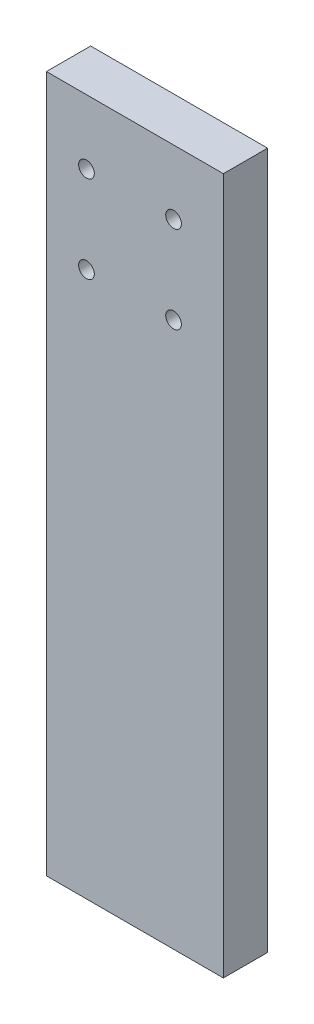
ISO-10303-21;
HEADER;
FILE_DESCRIPTION(('STEP AP214'),'2;1');
FILE_NAME('part.step','',(''),(''),'','','');
FILE_SCHEMA(('AUTOMOTIVE_DESIGN { 1 0 10303 214 1 1 1 1 }'));
ENDSEC;
DATA;
#1=APPLICATION_CONTEXT('core data for automotive mechanical design processes');
#2=APPLICATION_PROTOCOL_DEFINITION('international standard','automotive_design',2000,#1);
#3=PRODUCT_CONTEXT('',#1,'mechanical');
#4=PRODUCT('Part','Part','',(#3));
#5=PRODUCT_RELATED_PRODUCT_CATEGORY('part','',(#4));
#6=PRODUCT_DEFINITION_FORMATION('','',#4);
#7=PRODUCT_DEFINITION_CONTEXT('part definition',#1,'design');
#8=PRODUCT_DEFINITION('design','',#6,#7);
#9=PRODUCT_DEFINITION_SHAPE('','',#8);
#10=(LENGTH_UNIT() NAMED_UNIT(*) SI_UNIT(.MILLI.,.METRE.));
#11=(NAMED_UNIT(*) PLANE_ANGLE_UNIT() SI_UNIT($,.RADIAN.));
#12=(NAMED_UNIT(*) SI_UNIT($,.STERADIAN.) SOLID_ANGLE_UNIT());
#13=UNCERTAINTY_MEASURE_WITH_UNIT(LENGTH_MEASURE(1.E-05),#10,'distance_accuracy_value','');
#14=(GEOMETRIC_REPRESENTATION_CONTEXT(3) GLOBAL_UNCERTAINTY_ASSIGNED_CONTEXT((#13)) GLOBAL_UNIT_ASSIGNED_CONTEXT((#10,
#11,#12)) REPRESENTATION_CONTEXT('',''));
#15=CARTESIAN_POINT('',(0.,0.,0.));
#16=DIRECTION('',(0.,0.,1.));
#17=DIRECTION('',(1.,0.,0.));
#18=AXIS2_PLACEMENT_3D('',#15,#16,#17);
#19=CARTESIAN_POINT('',(26.8,0.,12.7));
#20=DIRECTION('',(1.,0.,0.));
#21=DIRECTION('',(0.,1.,0.));
#22=AXIS2_PLACEMENT_3D('',#19,#20,#21);
#23=PLANE('',#22);
#24=DIRECTION('',(0.,-1.,0.));
#25=VECTOR('',#24,1.);
#26=CARTESIAN_POINT('',(26.8,0.,0.));
#27=LINE('',#26,#25);
#28=CARTESIAN_POINT('',(26.8,62.,0.));
#29=VERTEX_POINT('',#28);
#30=CARTESIAN_POINT('',(26.8,-138.,0.));
#31=VERTEX_POINT('',#30);
#32=EDGE_CURVE('E114',#29,#31,#27,.T.);
#33=ORIENTED_EDGE('',*,*,#32,.F.);
#34=DIRECTION('',(0.,0.,-1.));
#35=VECTOR('',#34,1.);
#36=CARTESIAN_POINT('',(26.8,62.,12.7));
#37=LINE('',#36,#35);
#38=CARTESIAN_POINT('',(26.8,62.,12.7));
#39=VERTEX_POINT('',#38);
#40=EDGE_CURVE('E11',#39,#29,#37,.T.);
#41=ORIENTED_EDGE('',*,*,#40,.F.);
#42=DIRECTION('',(0.,-1.,0.));
#43=VECTOR('',#42,1.);
#44=CARTESIAN_POINT('',(26.8,0.,12.7));
#45=LINE('',#44,#43);
#46=CARTESIAN_POINT('',(26.8,-138.,12.7));
#47=VERTEX_POINT('',#46);
#48=EDGE_CURVE('E94',#39,#47,#45,.T.);
#49=ORIENTED_EDGE('',*,*,#48,.T.);
#50=DIRECTION('',(0.,0.,-1.));
#51=VECTOR('',#50,1.);
#52=CARTESIAN_POINT('',(26.8,-138.,12.7));
#53=LINE('',#52,#51);
#54=EDGE_CURVE('E73',#47,#31,#53,.T.);
#55=ORIENTED_EDGE('',*,*,#54,.T.);
#56=EDGE_LOOP('',(#33,#41,#49,#55));
#57=FACE_BOUND('',#56,.T.);
#58=ADVANCED_FACE('F33',(#57),#23,.T.);
#59=CARTESIAN_POINT('',(0.,62.,12.7));
#60=DIRECTION('',(0.,1.,0.));
#61=DIRECTION('',(0.,0.,1.));
#62=AXIS2_PLACEMENT_3D('',#59,#60,#61);
#63=PLANE('',#62);
#64=DIRECTION('',(1.,0.,0.));
#65=VECTOR('',#64,1.);
#66=CARTESIAN_POINT('',(0.,62.,0.));
#67=LINE('',#66,#65);
#68=CARTESIAN_POINT('',(-24.,62.,0.));
#69=VERTEX_POINT('',#68);
#70=EDGE_CURVE('E85',#69,#29,#67,.T.);
#71=ORIENTED_EDGE('',*,*,#70,.F.);
#72=DIRECTION('',(0.,0.,-1.));
#73=VECTOR('',#72,1.);
#74=CARTESIAN_POINT('',(-24.,62.,12.7));
#75=LINE('',#74,#73);
#76=CARTESIAN_POINT('',(-24.,62.,12.7));
#77=VERTEX_POINT('',#76);
#78=EDGE_CURVE('E42',#77,#69,#75,.T.);
#79=ORIENTED_EDGE('',*,*,#78,.F.);
#80=DIRECTION('',(1.,0.,0.));
#81=VECTOR('',#80,1.);
#82=CARTESIAN_POINT('',(0.,62.,12.7));
#83=LINE('',#82,#81);
#84=EDGE_CURVE('E83',#77,#39,#83,.T.);
#85=ORIENTED_EDGE('',*,*,#84,.T.);
#86=ORIENTED_EDGE('',*,*,#40,.T.);
#87=EDGE_LOOP('',(#71,#79,#85,#86));
#88=FACE_BOUND('',#87,.T.);
#89=ADVANCED_FACE('F81',(#88),#63,.T.);
#90=CARTESIAN_POINT('',(-24.,0.,12.7));
#91=DIRECTION('',(1.,0.,0.));
#92=DIRECTION('',(0.,1.,0.));
#93=AXIS2_PLACEMENT_3D('',#90,#91,#92);
#94=PLANE('',#93);
#95=DIRECTION('',(0.,-1.,0.));
#96=VECTOR('',#95,1.);
#97=CARTESIAN_POINT('',(-24.,0.,0.));
#98=LINE('',#97,#96);
#99=CARTESIAN_POINT('',(-24.,-138.,0.));
#100=VERTEX_POINT('',#99);
#101=EDGE_CURVE('E117',#69,#100,#98,.T.);
#102=ORIENTED_EDGE('',*,*,#101,.T.);
#103=DIRECTION('',(0.,0.,-1.));
#104=VECTOR('',#103,1.);
#105=CARTESIAN_POINT('',(-24.,-138.,12.7));
#106=LINE('',#105,#104);
#107=CARTESIAN_POINT('',(-24.,-138.,12.7));
#108=VERTEX_POINT('',#107);
#109=EDGE_CURVE('E88',#108,#100,#106,.T.);
#110=ORIENTED_EDGE('',*,*,#109,.F.);
#111=DIRECTION('',(0.,-1.,0.));
#112=VECTOR('',#111,1.);
#113=CARTESIAN_POINT('',(-24.,0.,12.7));
#114=LINE('',#113,#112);
#115=EDGE_CURVE('E90',#77,#108,#114,.T.);
#116=ORIENTED_EDGE('',*,*,#115,.F.);
#117=ORIENTED_EDGE('',*,*,#78,.T.);
#118=EDGE_LOOP('',(#102,#110,#116,#117));
#119=FACE_BOUND('',#118,.T.);
#120=ADVANCED_FACE('F91',(#119),#94,.F.);
#121=CARTESIAN_POINT('',(-12.5,18.5,12.7));
#122=DIRECTION('',(0.,0.,-1.));
#123=DIRECTION('',(-1.,0.,0.));
#124=AXIS2_PLACEMENT_3D('',#121,#122,#123);
#125=CYLINDRICAL_SURFACE('',#124,2.25);
#126=CARTESIAN_POINT('',(-12.5,18.5,12.7));
#127=DIRECTION('',(0.,0.,1.));
#128=DIRECTION('',(1.,0.,0.));
#129=AXIS2_PLACEMENT_3D('',#126,#127,#128);
#130=CIRCLE('',#129,2.25);
#131=CARTESIAN_POINT('',(-10.25,18.5,12.7));
#132=VERTEX_POINT('',#131);
#133=EDGE_CURVE('E96',#132,#132,#130,.T.);
#134=ORIENTED_EDGE('',*,*,#133,.T.);
#135=EDGE_LOOP('',(#134));
#136=FACE_BOUND('',#135,.T.);
#137=CARTESIAN_POINT('',(-12.5,18.5,0.));
#138=DIRECTION('',(0.,0.,1.));
#139=DIRECTION('',(1.,0.,0.));
#140=AXIS2_PLACEMENT_3D('',#137,#138,#139);
#141=CIRCLE('',#140,2.25);
#142=CARTESIAN_POINT('',(-10.25,18.5,0.));
#143=VERTEX_POINT('',#142);
#144=EDGE_CURVE('E111',#143,#143,#141,.T.);
#145=ORIENTED_EDGE('',*,*,#144,.F.);
#146=EDGE_LOOP('',(#145));
#147=FACE_BOUND('',#146,.T.);
#148=ADVANCED_FACE('F133',(#136,#147),#125,.F.);
#149=CARTESIAN_POINT('',(12.5,18.5,12.7));
#150=DIRECTION('',(0.,0.,-1.));
#151=DIRECTION('',(-1.,0.,0.));
#152=AXIS2_PLACEMENT_3D('',#149,#150,#151);
#153=CYLINDRICAL_SURFACE('',#152,2.25);
#154=CARTESIAN_POINT('',(12.5,18.5,12.7));
#155=DIRECTION('',(0.,0.,1.));
#156=DIRECTION('',(1.,0.,0.));
#157=AXIS2_PLACEMENT_3D('',#154,#155,#156);
#158=CIRCLE('',#157,2.25);
#159=CARTESIAN_POINT('',(14.75,18.5,12.7));
#160=VERTEX_POINT('',#159);
#161=EDGE_CURVE('E267',#160,#160,#158,.T.);
#162=ORIENTED_EDGE('',*,*,#161,.T.);
#163=EDGE_LOOP('',(#162));
#164=FACE_BOUND('',#163,.T.);
#165=CARTESIAN_POINT('',(12.5,18.5,0.));
#166=DIRECTION('',(0.,0.,1.));
#167=DIRECTION('',(1.,0.,0.));
#168=AXIS2_PLACEMENT_3D('',#165,#166,#167);
#169=CIRCLE('',#168,2.25);
#170=CARTESIAN_POINT('',(14.75,18.5,0.));
#171=VERTEX_POINT('',#170);
#172=EDGE_CURVE('E108',#171,#171,#169,.T.);
#173=ORIENTED_EDGE('',*,*,#172,.F.);
#174=EDGE_LOOP('',(#173));
#175=FACE_BOUND('',#174,.T.);
#176=ADVANCED_FACE('F136',(#164,#175),#153,.F.);
#177=CARTESIAN_POINT('',(12.5,43.5,12.7));
#178=DIRECTION('',(0.,0.,-1.));
#179=DIRECTION('',(-1.,0.,0.));
#180=AXIS2_PLACEMENT_3D('',#177,#178,#179);
#181=CYLINDRICAL_SURFACE('',#180,2.25);
#182=CARTESIAN_POINT('',(12.5,43.5,12.7));
#183=DIRECTION('',(0.,0.,1.));
#184=DIRECTION('',(1.,0.,0.));
#185=AXIS2_PLACEMENT_3D('',#182,#183,#184);
#186=CIRCLE('',#185,2.25);
#187=CARTESIAN_POINT('',(14.75,43.5,12.7));
#188=VERTEX_POINT('',#187);
#189=EDGE_CURVE('E150',#188,#188,#186,.T.);
#190=ORIENTED_EDGE('',*,*,#189,.T.);
#191=EDGE_LOOP('',(#190));
#192=FACE_BOUND('',#191,.T.);
#193=CARTESIAN_POINT('',(12.5,43.5,0.));
#194=DIRECTION('',(0.,0.,1.));
#195=DIRECTION('',(1.,0.,0.));
#196=AXIS2_PLACEMENT_3D('',#193,#194,#195);
#197=CIRCLE('',#196,2.25);
#198=CARTESIAN_POINT('',(14.75,43.5,0.));
#199=VERTEX_POINT('',#198);
#200=EDGE_CURVE('E104',#199,#199,#197,.T.);
#201=ORIENTED_EDGE('',*,*,#200,.F.);
#202=EDGE_LOOP('',(#201));
#203=FACE_BOUND('',#202,.T.);
#204=ADVANCED_FACE('F139',(#192,#203),#181,.F.);
#205=CARTESIAN_POINT('',(-12.5,43.5,12.7));
#206=DIRECTION('',(0.,0.,-1.));
#207=DIRECTION('',(-1.,0.,0.));
#208=AXIS2_PLACEMENT_3D('',#205,#206,#207);
#209=CYLINDRICAL_SURFACE('',#208,2.25);
#210=CARTESIAN_POINT('',(-12.5,43.5,12.7));
#211=DIRECTION('',(0.,0.,1.));
#212=DIRECTION('',(1.,0.,0.));
#213=AXIS2_PLACEMENT_3D('',#210,#211,#212);
#214=CIRCLE('',#213,2.25);
#215=CARTESIAN_POINT('',(-10.25,43.5,12.7));
#216=VERTEX_POINT('',#215);
#217=EDGE_CURVE('E120',#216,#216,#214,.T.);
#218=ORIENTED_EDGE('',*,*,#217,.T.);
#219=EDGE_LOOP('',(#218));
#220=FACE_BOUND('',#219,.T.);
#221=CARTESIAN_POINT('',(-12.5,43.5,0.));
#222=DIRECTION('',(0.,0.,1.));
#223=DIRECTION('',(1.,0.,0.));
#224=AXIS2_PLACEMENT_3D('',#221,#222,#223);
#225=CIRCLE('',#224,2.25);
#226=CARTESIAN_POINT('',(-10.25,43.5,0.));
#227=VERTEX_POINT('',#226);
#228=EDGE_CURVE('E101',#227,#227,#225,.T.);
#229=ORIENTED_EDGE('',*,*,#228,.F.);
#230=EDGE_LOOP('',(#229));
#231=FACE_BOUND('',#230,.T.);
#232=ADVANCED_FACE('F35',(#220,#231),#209,.F.);
#233=CARTESIAN_POINT('',(0.,-138.,12.7));
#234=DIRECTION('',(0.,1.,0.));
#235=DIRECTION('',(0.,0.,1.));
#236=AXIS2_PLACEMENT_3D('',#233,#234,#235);
#237=PLANE('',#236);
#238=CARTESIAN_POINT('',(16.4,-138.,6.35));
#239=DIRECTION('',(0.,-1.,0.));
#240=DIRECTION('',(0.,0.,-1.));
#241=AXIS2_PLACEMENT_3D('',#238,#239,#240);
#242=CIRCLE('',#241,1.5);
#243=CARTESIAN_POINT('',(16.4,-138.,4.85));
#244=VERTEX_POINT('',#243);
#245=EDGE_CURVE('E255',#244,#244,#242,.T.);
#246=ORIENTED_EDGE('',*,*,#245,.F.);
#247=EDGE_LOOP('',(#246));
#248=FACE_BOUND('',#247,.T.);
#249=CARTESIAN_POINT('',(-13.6,-138.,6.35));
#250=DIRECTION('',(0.,-1.,0.));
#251=DIRECTION('',(0.,0.,-1.));
#252=AXIS2_PLACEMENT_3D('',#249,#250,#251);
#253=CIRCLE('',#252,1.5);
#254=CARTESIAN_POINT('',(-13.6,-138.,4.85));
#255=VERTEX_POINT('',#254);
#256=EDGE_CURVE('E254',#255,#255,#253,.T.);
#257=ORIENTED_EDGE('',*,*,#256,.F.);
#258=EDGE_LOOP('',(#257));
#259=FACE_BOUND('',#258,.T.);
#260=DIRECTION('',(1.,0.,0.));
#261=VECTOR('',#260,1.);
#262=CARTESIAN_POINT('',(0.,-138.,0.));
#263=LINE('',#262,#261);
#264=EDGE_CURVE('E66',#100,#31,#263,.T.);
#265=ORIENTED_EDGE('',*,*,#264,.T.);
#266=ORIENTED_EDGE('',*,*,#54,.F.);
#267=DIRECTION('',(1.,0.,0.));
#268=VECTOR('',#267,1.);
#269=CARTESIAN_POINT('',(0.,-138.,12.7));
#270=LINE('',#269,#268);
#271=EDGE_CURVE('E50',#108,#47,#270,.T.);
#272=ORIENTED_EDGE('',*,*,#271,.F.);
#273=ORIENTED_EDGE('',*,*,#109,.T.);
#274=EDGE_LOOP('',(#265,#266,#272,#273));
#275=FACE_BOUND('',#274,.T.);
#276=ADVANCED_FACE('F123',(#248,#259,#275),#237,.F.);
#277=CARTESIAN_POINT('',(0.,0.,12.7));
#278=DIRECTION('',(0.,0.,1.));
#279=DIRECTION('',(1.,0.,0.));
#280=AXIS2_PLACEMENT_3D('',#277,#278,#279);
#281=PLANE('',#280);
#282=ORIENTED_EDGE('',*,*,#217,.F.);
#283=EDGE_LOOP('',(#282));
#284=FACE_BOUND('',#283,.T.);
#285=ORIENTED_EDGE('',*,*,#189,.F.);
#286=EDGE_LOOP('',(#285));
#287=FACE_BOUND('',#286,.T.);
#288=ORIENTED_EDGE('',*,*,#161,.F.);
#289=EDGE_LOOP('',(#288));
#290=FACE_BOUND('',#289,.T.);
#291=ORIENTED_EDGE('',*,*,#133,.F.);
#292=EDGE_LOOP('',(#291));
#293=FACE_BOUND('',#292,.T.);
#294=ORIENTED_EDGE('',*,*,#48,.F.);
#295=ORIENTED_EDGE('',*,*,#84,.F.);
#296=ORIENTED_EDGE('',*,*,#115,.T.);
#297=ORIENTED_EDGE('',*,*,#271,.T.);
#298=EDGE_LOOP('',(#294,#295,#296,#297));
#299=FACE_BOUND('',#298,.T.);
#300=ADVANCED_FACE('F93',(#284,#287,#290,#293,#299),#281,.T.);
#301=CARTESIAN_POINT('',(0.,0.,0.));
#302=DIRECTION('',(0.,0.,1.));
#303=DIRECTION('',(1.,0.,0.));
#304=AXIS2_PLACEMENT_3D('',#301,#302,#303);
#305=PLANE('',#304);
#306=ORIENTED_EDGE('',*,*,#228,.T.);
#307=EDGE_LOOP('',(#306));
#308=FACE_BOUND('',#307,.T.);
#309=ORIENTED_EDGE('',*,*,#200,.T.);
#310=EDGE_LOOP('',(#309));
#311=FACE_BOUND('',#310,.T.);
#312=ORIENTED_EDGE('',*,*,#172,.T.);
#313=EDGE_LOOP('',(#312));
#314=FACE_BOUND('',#313,.T.);
#315=ORIENTED_EDGE('',*,*,#144,.T.);
#316=EDGE_LOOP('',(#315));
#317=FACE_BOUND('',#316,.T.);
#318=ORIENTED_EDGE('',*,*,#32,.T.);
#319=ORIENTED_EDGE('',*,*,#264,.F.);
#320=ORIENTED_EDGE('',*,*,#101,.F.);
#321=ORIENTED_EDGE('',*,*,#70,.T.);
#322=EDGE_LOOP('',(#318,#319,#320,#321));
#323=FACE_BOUND('',#322,.T.);
#324=ADVANCED_FACE('F124',(#308,#311,#314,#317,#323),#305,.F.);
#325=CARTESIAN_POINT('',(-13.6,-118.,6.35));
#326=DIRECTION('',(0.,-1.,0.));
#327=DIRECTION('',(0.,0.,-1.));
#328=AXIS2_PLACEMENT_3D('',#325,#326,#327);
#329=CYLINDRICAL_SURFACE('',#328,1.5);
#330=CARTESIAN_POINT('',(-13.6,-118.,6.35));
#331=DIRECTION('',(0.,-1.,0.));
#332=DIRECTION('',(0.,0.,-1.));
#333=AXIS2_PLACEMENT_3D('',#330,#331,#332);
#334=CIRCLE('',#333,1.5);
#335=CARTESIAN_POINT('',(-13.6,-118.,4.85));
#336=VERTEX_POINT('',#335);
#337=EDGE_CURVE('E105',#336,#336,#334,.T.);
#338=ORIENTED_EDGE('',*,*,#337,.F.);
#339=EDGE_LOOP('',(#338));
#340=FACE_BOUND('',#339,.T.);
#341=ORIENTED_EDGE('',*,*,#256,.T.);
#342=EDGE_LOOP('',(#341));
#343=FACE_BOUND('',#342,.T.);
#344=ADVANCED_FACE('F155',(#340,#343),#329,.F.);
#345=CARTESIAN_POINT('',(-13.6,-118.,6.35));
#346=DIRECTION('',(0.,-1.,0.));
#347=DIRECTION('',(0.,0.,-1.));
#348=AXIS2_PLACEMENT_3D('',#345,#346,#347);
#349=PLANE('',#348);
#350=ORIENTED_EDGE('',*,*,#337,.T.);
#351=EDGE_LOOP('',(#350));
#352=FACE_BOUND('',#351,.T.);
#353=ADVANCED_FACE('F167',(#352),#349,.T.);
#354=CARTESIAN_POINT('',(16.4,-118.,6.35));
#355=DIRECTION('',(0.,-1.,0.));
#356=DIRECTION('',(0.,0.,-1.));
#357=AXIS2_PLACEMENT_3D('',#354,#355,#356);
#358=CYLINDRICAL_SURFACE('',#357,1.5);
#359=CARTESIAN_POINT('',(16.4,-118.,6.35));
#360=DIRECTION('',(0.,-1.,0.));
#361=DIRECTION('',(0.,0.,-1.));
#362=AXIS2_PLACEMENT_3D('',#359,#360,#361);
#363=CIRCLE('',#362,1.5);
#364=CARTESIAN_POINT('',(16.4,-118.,4.85));
#365=VERTEX_POINT('',#364);
#366=EDGE_CURVE('E253',#365,#365,#363,.T.);
#367=ORIENTED_EDGE('',*,*,#366,.F.);
#368=EDGE_LOOP('',(#367));
#369=FACE_BOUND('',#368,.T.);
#370=ORIENTED_EDGE('',*,*,#245,.T.);
#371=EDGE_LOOP('',(#370));
#372=FACE_BOUND('',#371,.T.);
#373=ADVANCED_FACE('F227',(#369,#372),#358,.F.);
#374=CARTESIAN_POINT('',(16.4,-118.,6.35));
#375=DIRECTION('',(0.,-1.,0.));
#376=DIRECTION('',(0.,0.,-1.));
#377=AXIS2_PLACEMENT_3D('',#374,#375,#376);
#378=PLANE('',#377);
#379=ORIENTED_EDGE('',*,*,#366,.T.);
#380=EDGE_LOOP('',(#379));
#381=FACE_BOUND('',#380,.T.);
#382=ADVANCED_FACE('F237',(#381),#378,.T.);
#383=CLOSED_SHELL('',(#58,#89,#120,#148,#176,#204,#232,#276,#300,#324,#344,#353,#373,#382));
#384=MANIFOLD_SOLID_BREP('B2',#383);
#385=ADVANCED_BREP_SHAPE_REPRESENTATION('',(#18,#384),#14);
#386=SHAPE_DEFINITION_REPRESENTATION(#9,#385);
ENDSEC;
END-ISO-10303-21;
